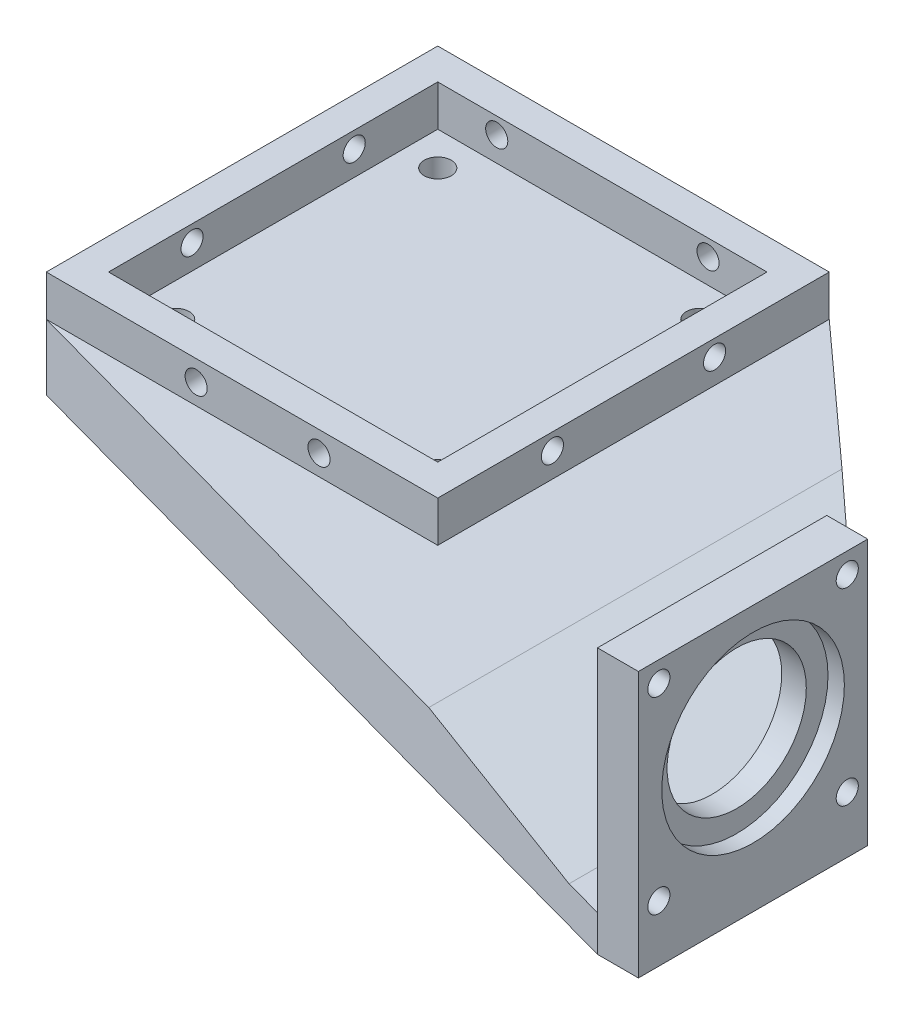
ISO-10303-21;
HEADER;
FILE_DESCRIPTION(('STEP AP214'),'2;1');
FILE_NAME('part.step','',(''),(''),'','','');
FILE_SCHEMA(('AUTOMOTIVE_DESIGN { 1 0 10303 214 1 1 1 1 }'));
ENDSEC;
DATA;
#1=APPLICATION_CONTEXT('core data for automotive mechanical design processes');
#2=APPLICATION_PROTOCOL_DEFINITION('international standard','automotive_design',2000,#1);
#3=PRODUCT_CONTEXT('',#1,'mechanical');
#4=PRODUCT('Part','Part','',(#3));
#5=PRODUCT_RELATED_PRODUCT_CATEGORY('part','',(#4));
#6=PRODUCT_DEFINITION_FORMATION('','',#4);
#7=PRODUCT_DEFINITION_CONTEXT('part definition',#1,'design');
#8=PRODUCT_DEFINITION('design','',#6,#7);
#9=PRODUCT_DEFINITION_SHAPE('','',#8);
#10=(LENGTH_UNIT() NAMED_UNIT(*) SI_UNIT(.MILLI.,.METRE.));
#11=(NAMED_UNIT(*) PLANE_ANGLE_UNIT() SI_UNIT($,.RADIAN.));
#12=(NAMED_UNIT(*) SI_UNIT($,.STERADIAN.) SOLID_ANGLE_UNIT());
#13=UNCERTAINTY_MEASURE_WITH_UNIT(LENGTH_MEASURE(1.E-05),#10,'distance_accuracy_value','');
#14=(GEOMETRIC_REPRESENTATION_CONTEXT(3) GLOBAL_UNCERTAINTY_ASSIGNED_CONTEXT((#13)) GLOBAL_UNIT_ASSIGNED_CONTEXT((#10,
#11,#12)) REPRESENTATION_CONTEXT('',''));
#15=CARTESIAN_POINT('',(0.,0.,0.));
#16=DIRECTION('',(0.,0.,1.));
#17=DIRECTION('',(1.,0.,0.));
#18=AXIS2_PLACEMENT_3D('',#15,#16,#17);
#19=CARTESIAN_POINT('',(0.,5.,0.));
#20=DIRECTION('',(0.,-1.,0.));
#21=DIRECTION('',(0.,0.,-1.));
#22=AXIS2_PLACEMENT_3D('',#19,#20,#21);
#23=PLANE('',#22);
#24=DIRECTION('',(-1.,0.,0.));
#25=VECTOR('',#24,1.);
#26=CARTESIAN_POINT('',(-23.9,5.,-23.9));
#27=LINE('',#26,#25);
#28=CARTESIAN_POINT('',(23.9,5.,-23.9));
#29=VERTEX_POINT('',#28);
#30=CARTESIAN_POINT('',(-23.9,5.,-23.9));
#31=VERTEX_POINT('',#30);
#32=EDGE_CURVE('E425',#29,#31,#27,.T.);
#33=ORIENTED_EDGE('',*,*,#32,.T.);
#34=DIRECTION('',(0.,0.,1.));
#35=VECTOR('',#34,1.);
#36=CARTESIAN_POINT('',(-23.9,5.,-23.9));
#37=LINE('',#36,#35);
#38=CARTESIAN_POINT('',(-23.9,5.,23.9));
#39=VERTEX_POINT('',#38);
#40=EDGE_CURVE('E429',#31,#39,#37,.T.);
#41=ORIENTED_EDGE('',*,*,#40,.T.);
#42=DIRECTION('',(1.,0.,0.));
#43=VECTOR('',#42,1.);
#44=CARTESIAN_POINT('',(-23.9,5.,23.9));
#45=LINE('',#44,#43);
#46=CARTESIAN_POINT('',(23.9,5.,23.9));
#47=VERTEX_POINT('',#46);
#48=EDGE_CURVE('E433',#39,#47,#45,.T.);
#49=ORIENTED_EDGE('',*,*,#48,.T.);
#50=DIRECTION('',(0.,0.,-1.));
#51=VECTOR('',#50,1.);
#52=CARTESIAN_POINT('',(23.9,5.,-23.9));
#53=LINE('',#52,#51);
#54=EDGE_CURVE('E436',#47,#29,#53,.T.);
#55=ORIENTED_EDGE('',*,*,#54,.T.);
#56=EDGE_LOOP('',(#33,#41,#49,#55));
#57=FACE_BOUND('',#56,.T.);
#58=DIRECTION('',(0.,0.,1.));
#59=VECTOR('',#58,1.);
#60=CARTESIAN_POINT('',(-20.1,5.,-20.1));
#61=LINE('',#60,#59);
#62=CARTESIAN_POINT('',(-20.1,5.,-20.1));
#63=VERTEX_POINT('',#62);
#64=CARTESIAN_POINT('',(-20.1,5.,20.1));
#65=VERTEX_POINT('',#64);
#66=EDGE_CURVE('E384',#63,#65,#61,.T.);
#67=ORIENTED_EDGE('',*,*,#66,.F.);
#68=DIRECTION('',(-1.,0.,0.));
#69=VECTOR('',#68,1.);
#70=CARTESIAN_POINT('',(-20.1,5.,-20.1));
#71=LINE('',#70,#69);
#72=CARTESIAN_POINT('',(20.1,5.,-20.1));
#73=VERTEX_POINT('',#72);
#74=EDGE_CURVE('E394',#73,#63,#71,.T.);
#75=ORIENTED_EDGE('',*,*,#74,.F.);
#76=DIRECTION('',(0.,0.,-1.));
#77=VECTOR('',#76,1.);
#78=CARTESIAN_POINT('',(20.1,5.,-20.1));
#79=LINE('',#78,#77);
#80=CARTESIAN_POINT('',(20.1,5.,20.1));
#81=VERTEX_POINT('',#80);
#82=EDGE_CURVE('E391',#81,#73,#79,.T.);
#83=ORIENTED_EDGE('',*,*,#82,.F.);
#84=DIRECTION('',(1.,0.,0.));
#85=VECTOR('',#84,1.);
#86=CARTESIAN_POINT('',(-20.1,5.,20.1));
#87=LINE('',#86,#85);
#88=EDGE_CURVE('E387',#65,#81,#87,.T.);
#89=ORIENTED_EDGE('',*,*,#88,.F.);
#90=EDGE_LOOP('',(#67,#75,#83,#89));
#91=FACE_BOUND('',#90,.T.);
#92=ADVANCED_FACE('F41',(#57,#91),#23,.F.);
#93=CARTESIAN_POINT('',(-23.9,5.,-23.9));
#94=DIRECTION('',(0.,0.,1.));
#95=DIRECTION('',(1.,0.,0.));
#96=AXIS2_PLACEMENT_3D('',#93,#94,#95);
#97=PLANE('',#96);
#98=CARTESIAN_POINT('',(12.9,3.,-23.9));
#99=DIRECTION('',(0.,0.,-1.));
#100=DIRECTION('',(-1.,0.,0.));
#101=AXIS2_PLACEMENT_3D('',#98,#99,#100);
#102=CIRCLE('',#101,1.35);
#103=CARTESIAN_POINT('',(11.55,3.,-23.9));
#104=VERTEX_POINT('',#103);
#105=EDGE_CURVE('E368',#104,#104,#102,.T.);
#106=ORIENTED_EDGE('',*,*,#105,.F.);
#107=EDGE_LOOP('',(#106));
#108=FACE_BOUND('',#107,.T.);
#109=CARTESIAN_POINT('',(-12.9,3.,-23.9));
#110=DIRECTION('',(0.,0.,-1.));
#111=DIRECTION('',(-1.,0.,0.));
#112=AXIS2_PLACEMENT_3D('',#109,#110,#111);
#113=CIRCLE('',#112,1.35);
#114=CARTESIAN_POINT('',(-14.25,3.,-23.9));
#115=VERTEX_POINT('',#114);
#116=EDGE_CURVE('E377',#115,#115,#113,.T.);
#117=ORIENTED_EDGE('',*,*,#116,.F.);
#118=EDGE_LOOP('',(#117));
#119=FACE_BOUND('',#118,.T.);
#120=DIRECTION('',(0.,-1.,0.));
#121=VECTOR('',#120,1.);
#122=CARTESIAN_POINT('',(23.9,5.,-23.9));
#123=LINE('',#122,#121);
#124=CARTESIAN_POINT('',(23.9,0.,-23.9));
#125=VERTEX_POINT('',#124);
#126=EDGE_CURVE('E439',#29,#125,#123,.T.);
#127=ORIENTED_EDGE('',*,*,#126,.T.);
#128=DIRECTION('',(0.,1.,0.));
#129=VECTOR('',#128,1.);
#130=CARTESIAN_POINT('',(23.9,-8.,-23.9));
#131=LINE('',#130,#129);
#132=CARTESIAN_POINT('',(23.9,-8.,-23.9));
#133=VERTEX_POINT('',#132);
#134=EDGE_CURVE('E319',#133,#125,#131,.T.);
#135=ORIENTED_EDGE('',*,*,#134,.F.);
#136=DIRECTION('',(-1.,0.,0.));
#137=VECTOR('',#136,1.);
#138=CARTESIAN_POINT('',(0.,-8.,-23.9));
#139=LINE('',#138,#137);
#140=CARTESIAN_POINT('',(-23.9,-8.,-23.9));
#141=VERTEX_POINT('',#140);
#142=EDGE_CURVE('E257',#133,#141,#139,.T.);
#143=ORIENTED_EDGE('',*,*,#142,.T.);
#144=DIRECTION('',(0.,-1.,0.));
#145=VECTOR('',#144,1.);
#146=CARTESIAN_POINT('',(-23.9,5.,-23.9));
#147=LINE('',#146,#145);
#148=EDGE_CURVE('E457',#31,#141,#147,.T.);
#149=ORIENTED_EDGE('',*,*,#148,.F.);
#150=ORIENTED_EDGE('',*,*,#32,.F.);
#151=EDGE_LOOP('',(#127,#135,#143,#149,#150));
#152=FACE_BOUND('',#151,.T.);
#153=ADVANCED_FACE('F43',(#108,#119,#152),#97,.F.);
#154=CARTESIAN_POINT('',(-23.9,5.,-23.9));
#155=DIRECTION('',(1.,0.,0.));
#156=DIRECTION('',(0.,0.,-1.));
#157=AXIS2_PLACEMENT_3D('',#154,#155,#156);
#158=PLANE('',#157);
#159=CARTESIAN_POINT('',(-23.9,3.,9.90000000000001));
#160=DIRECTION('',(1.,0.,0.));
#161=DIRECTION('',(0.,0.,-1.));
#162=AXIS2_PLACEMENT_3D('',#159,#160,#161);
#163=CIRCLE('',#162,1.35);
#164=CARTESIAN_POINT('',(-23.9,3.,8.55000000000001));
#165=VERTEX_POINT('',#164);
#166=EDGE_CURVE('E326',#165,#165,#163,.T.);
#167=ORIENTED_EDGE('',*,*,#166,.T.);
#168=EDGE_LOOP('',(#167));
#169=FACE_BOUND('',#168,.T.);
#170=CARTESIAN_POINT('',(-23.9,3.,-9.9));
#171=DIRECTION('',(1.,0.,0.));
#172=DIRECTION('',(0.,0.,1.));
#173=AXIS2_PLACEMENT_3D('',#170,#171,#172);
#174=CIRCLE('',#173,1.35);
#175=CARTESIAN_POINT('',(-23.9,3.,-8.55));
#176=VERTEX_POINT('',#175);
#177=EDGE_CURVE('E335',#176,#176,#174,.T.);
#178=ORIENTED_EDGE('',*,*,#177,.T.);
#179=EDGE_LOOP('',(#178));
#180=FACE_BOUND('',#179,.T.);
#181=ORIENTED_EDGE('',*,*,#148,.T.);
#182=DIRECTION('',(0.,0.,1.));
#183=VECTOR('',#182,1.);
#184=CARTESIAN_POINT('',(-23.9,-8.,0.));
#185=LINE('',#184,#183);
#186=CARTESIAN_POINT('',(-23.9,-8.,23.9));
#187=VERTEX_POINT('',#186);
#188=EDGE_CURVE('E261',#141,#187,#185,.T.);
#189=ORIENTED_EDGE('',*,*,#188,.T.);
#190=DIRECTION('',(0.,1.,0.));
#191=VECTOR('',#190,1.);
#192=CARTESIAN_POINT('',(-23.9,-8.,23.9));
#193=LINE('',#192,#191);
#194=CARTESIAN_POINT('',(-23.9,0.,23.9));
#195=VERTEX_POINT('',#194);
#196=EDGE_CURVE('E315',#187,#195,#193,.T.);
#197=ORIENTED_EDGE('',*,*,#196,.T.);
#198=DIRECTION('',(0.,-1.,0.));
#199=VECTOR('',#198,1.);
#200=CARTESIAN_POINT('',(-23.9,5.,23.9));
#201=LINE('',#200,#199);
#202=EDGE_CURVE('E453',#39,#195,#201,.T.);
#203=ORIENTED_EDGE('',*,*,#202,.F.);
#204=ORIENTED_EDGE('',*,*,#40,.F.);
#205=EDGE_LOOP('',(#181,#189,#197,#203,#204));
#206=FACE_BOUND('',#205,.T.);
#207=ADVANCED_FACE('F494',(#169,#180,#206),#158,.F.);
#208=CARTESIAN_POINT('',(-23.9,5.,23.9));
#209=DIRECTION('',(0.,0.,-1.));
#210=DIRECTION('',(-1.,0.,0.));
#211=AXIS2_PLACEMENT_3D('',#208,#209,#210);
#212=PLANE('',#211);
#213=CARTESIAN_POINT('',(9.4,2.5,23.9));
#214=DIRECTION('',(0.,0.,1.));
#215=DIRECTION('',(1.,0.,0.));
#216=AXIS2_PLACEMENT_3D('',#213,#214,#215);
#217=CIRCLE('',#216,1.35);
#218=CARTESIAN_POINT('',(10.75,2.5,23.9));
#219=VERTEX_POINT('',#218);
#220=EDGE_CURVE('E356',#219,#219,#217,.T.);
#221=ORIENTED_EDGE('',*,*,#220,.F.);
#222=EDGE_LOOP('',(#221));
#223=FACE_BOUND('',#222,.T.);
#224=CARTESIAN_POINT('',(-5.6,2.5,23.9));
#225=DIRECTION('',(0.,0.,1.));
#226=DIRECTION('',(1.,0.,0.));
#227=AXIS2_PLACEMENT_3D('',#224,#225,#226);
#228=CIRCLE('',#227,1.35);
#229=CARTESIAN_POINT('',(-4.24999999999999,2.5,23.9));
#230=VERTEX_POINT('',#229);
#231=EDGE_CURVE('E357',#230,#230,#228,.T.);
#232=ORIENTED_EDGE('',*,*,#231,.F.);
#233=EDGE_LOOP('',(#232));
#234=FACE_BOUND('',#233,.T.);
#235=DIRECTION('',(1.,0.,0.));
#236=VECTOR('',#235,1.);
#237=CARTESIAN_POINT('',(-23.9,0.,23.9));
#238=LINE('',#237,#236);
#239=CARTESIAN_POINT('',(23.9,0.,23.9));
#240=VERTEX_POINT('',#239);
#241=EDGE_CURVE('E424',#195,#240,#238,.T.);
#242=ORIENTED_EDGE('',*,*,#241,.T.);
#243=DIRECTION('',(0.,-1.,0.));
#244=VECTOR('',#243,1.);
#245=CARTESIAN_POINT('',(23.9,5.,23.9));
#246=LINE('',#245,#244);
#247=EDGE_CURVE('E449',#47,#240,#246,.T.);
#248=ORIENTED_EDGE('',*,*,#247,.F.);
#249=ORIENTED_EDGE('',*,*,#48,.F.);
#250=ORIENTED_EDGE('',*,*,#202,.T.);
#251=EDGE_LOOP('',(#242,#248,#249,#250));
#252=FACE_BOUND('',#251,.T.);
#253=ADVANCED_FACE('F491',(#223,#234,#252),#212,.F.);
#254=CARTESIAN_POINT('',(23.9,5.,-23.9));
#255=DIRECTION('',(-1.,0.,0.));
#256=DIRECTION('',(0.,0.,1.));
#257=AXIS2_PLACEMENT_3D('',#254,#255,#256);
#258=PLANE('',#257);
#259=CARTESIAN_POINT('',(23.9,3.,9.9));
#260=DIRECTION('',(1.,0.,0.));
#261=DIRECTION('',(0.,0.,-1.));
#262=AXIS2_PLACEMENT_3D('',#259,#260,#261);
#263=CIRCLE('',#262,1.35);
#264=CARTESIAN_POINT('',(23.9,3.,8.55));
#265=VERTEX_POINT('',#264);
#266=EDGE_CURVE('E331',#265,#265,#263,.T.);
#267=ORIENTED_EDGE('',*,*,#266,.F.);
#268=EDGE_LOOP('',(#267));
#269=FACE_BOUND('',#268,.T.);
#270=CARTESIAN_POINT('',(23.9,3.,-9.90000000000001));
#271=DIRECTION('',(1.,0.,0.));
#272=DIRECTION('',(0.,0.,1.));
#273=AXIS2_PLACEMENT_3D('',#270,#271,#272);
#274=CIRCLE('',#273,1.35);
#275=CARTESIAN_POINT('',(23.9,3.,-8.55000000000001));
#276=VERTEX_POINT('',#275);
#277=EDGE_CURVE('E311',#276,#276,#274,.T.);
#278=ORIENTED_EDGE('',*,*,#277,.F.);
#279=EDGE_LOOP('',(#278));
#280=FACE_BOUND('',#279,.T.);
#281=DIRECTION('',(0.,0.,-1.));
#282=VECTOR('',#281,1.);
#283=CARTESIAN_POINT('',(23.9,0.,-23.9));
#284=LINE('',#283,#282);
#285=EDGE_CURVE('E430',#240,#125,#284,.T.);
#286=ORIENTED_EDGE('',*,*,#285,.T.);
#287=ORIENTED_EDGE('',*,*,#126,.F.);
#288=ORIENTED_EDGE('',*,*,#54,.F.);
#289=ORIENTED_EDGE('',*,*,#247,.T.);
#290=EDGE_LOOP('',(#286,#287,#288,#289));
#291=FACE_BOUND('',#290,.T.);
#292=ADVANCED_FACE('F481',(#269,#280,#291),#258,.F.);
#293=CARTESIAN_POINT('',(-20.1,5.,-20.1));
#294=DIRECTION('',(1.,0.,0.));
#295=DIRECTION('',(0.,0.,-1.));
#296=AXIS2_PLACEMENT_3D('',#293,#294,#295);
#297=PLANE('',#296);
#298=CARTESIAN_POINT('',(-20.1,3.,9.90000000000001));
#299=DIRECTION('',(1.,0.,0.));
#300=DIRECTION('',(0.,0.,-1.));
#301=AXIS2_PLACEMENT_3D('',#298,#299,#300);
#302=CIRCLE('',#301,1.35);
#303=CARTESIAN_POINT('',(-20.1,3.,8.55000000000001));
#304=VERTEX_POINT('',#303);
#305=EDGE_CURVE('E347',#304,#304,#302,.T.);
#306=ORIENTED_EDGE('',*,*,#305,.F.);
#307=EDGE_LOOP('',(#306));
#308=FACE_BOUND('',#307,.T.);
#309=CARTESIAN_POINT('',(-20.1,3.,-9.9));
#310=DIRECTION('',(1.,0.,0.));
#311=DIRECTION('',(0.,0.,-1.));
#312=AXIS2_PLACEMENT_3D('',#309,#310,#311);
#313=CIRCLE('',#312,1.35);
#314=CARTESIAN_POINT('',(-20.1,3.,-11.25));
#315=VERTEX_POINT('',#314);
#316=EDGE_CURVE('E342',#315,#315,#313,.T.);
#317=ORIENTED_EDGE('',*,*,#316,.F.);
#318=EDGE_LOOP('',(#317));
#319=FACE_BOUND('',#318,.T.);
#320=DIRECTION('',(0.,0.,1.));
#321=VECTOR('',#320,1.);
#322=CARTESIAN_POINT('',(-20.1,0.,-20.1));
#323=LINE('',#322,#321);
#324=CARTESIAN_POINT('',(-20.1,0.,-20.1));
#325=VERTEX_POINT('',#324);
#326=CARTESIAN_POINT('',(-20.1,0.,20.1));
#327=VERTEX_POINT('',#326);
#328=EDGE_CURVE('E372',#325,#327,#323,.T.);
#329=ORIENTED_EDGE('',*,*,#328,.F.);
#330=DIRECTION('',(0.,-1.,0.));
#331=VECTOR('',#330,1.);
#332=CARTESIAN_POINT('',(-20.1,5.,-20.1));
#333=LINE('',#332,#331);
#334=EDGE_CURVE('E397',#63,#325,#333,.T.);
#335=ORIENTED_EDGE('',*,*,#334,.F.);
#336=ORIENTED_EDGE('',*,*,#66,.T.);
#337=DIRECTION('',(0.,-1.,0.));
#338=VECTOR('',#337,1.);
#339=CARTESIAN_POINT('',(-20.1,5.,20.1));
#340=LINE('',#339,#338);
#341=EDGE_CURVE('E420',#65,#327,#340,.T.);
#342=ORIENTED_EDGE('',*,*,#341,.T.);
#343=EDGE_LOOP('',(#329,#335,#336,#342));
#344=FACE_BOUND('',#343,.T.);
#345=ADVANCED_FACE('F533',(#308,#319,#344),#297,.T.);
#346=CARTESIAN_POINT('',(-20.1,5.,20.1));
#347=DIRECTION('',(0.,0.,-1.));
#348=DIRECTION('',(-1.,0.,0.));
#349=AXIS2_PLACEMENT_3D('',#346,#347,#348);
#350=PLANE('',#349);
#351=CARTESIAN_POINT('',(9.4,2.5,20.1));
#352=DIRECTION('',(0.,0.,-1.));
#353=DIRECTION('',(-1.,0.,0.));
#354=AXIS2_PLACEMENT_3D('',#351,#352,#353);
#355=CIRCLE('',#354,1.35);
#356=CARTESIAN_POINT('',(8.05,2.5,20.1));
#357=VERTEX_POINT('',#356);
#358=EDGE_CURVE('E352',#357,#357,#355,.F.);
#359=ORIENTED_EDGE('',*,*,#358,.T.);
#360=EDGE_LOOP('',(#359));
#361=FACE_BOUND('',#360,.T.);
#362=CARTESIAN_POINT('',(-5.6,2.5,20.1));
#363=DIRECTION('',(0.,0.,-1.));
#364=DIRECTION('',(-1.,0.,0.));
#365=AXIS2_PLACEMENT_3D('',#362,#363,#364);
#366=CIRCLE('',#365,1.35);
#367=CARTESIAN_POINT('',(-6.95,2.5,20.1));
#368=VERTEX_POINT('',#367);
#369=EDGE_CURVE('E351',#368,#368,#366,.F.);
#370=ORIENTED_EDGE('',*,*,#369,.T.);
#371=EDGE_LOOP('',(#370));
#372=FACE_BOUND('',#371,.T.);
#373=DIRECTION('',(1.,0.,0.));
#374=VECTOR('',#373,1.);
#375=CARTESIAN_POINT('',(-20.1,0.,20.1));
#376=LINE('',#375,#374);
#377=CARTESIAN_POINT('',(20.1,0.,20.1));
#378=VERTEX_POINT('',#377);
#379=EDGE_CURVE('E401',#327,#378,#376,.T.);
#380=ORIENTED_EDGE('',*,*,#379,.F.);
#381=ORIENTED_EDGE('',*,*,#341,.F.);
#382=ORIENTED_EDGE('',*,*,#88,.T.);
#383=DIRECTION('',(0.,-1.,0.));
#384=VECTOR('',#383,1.);
#385=CARTESIAN_POINT('',(20.1,5.,20.1));
#386=LINE('',#385,#384);
#387=EDGE_CURVE('E417',#81,#378,#386,.T.);
#388=ORIENTED_EDGE('',*,*,#387,.T.);
#389=EDGE_LOOP('',(#380,#381,#382,#388));
#390=FACE_BOUND('',#389,.T.);
#391=ADVANCED_FACE('F580',(#361,#372,#390),#350,.T.);
#392=CARTESIAN_POINT('',(20.1,5.,-20.1));
#393=DIRECTION('',(-1.,0.,0.));
#394=DIRECTION('',(0.,0.,1.));
#395=AXIS2_PLACEMENT_3D('',#392,#393,#394);
#396=PLANE('',#395);
#397=CARTESIAN_POINT('',(20.1,3.,9.9));
#398=DIRECTION('',(-1.,0.,0.));
#399=DIRECTION('',(0.,0.,1.));
#400=AXIS2_PLACEMENT_3D('',#397,#398,#399);
#401=CIRCLE('',#400,1.35);
#402=CARTESIAN_POINT('',(20.1,3.,11.25));
#403=VERTEX_POINT('',#402);
#404=EDGE_CURVE('E346',#403,#403,#401,.T.);
#405=ORIENTED_EDGE('',*,*,#404,.F.);
#406=EDGE_LOOP('',(#405));
#407=FACE_BOUND('',#406,.T.);
#408=CARTESIAN_POINT('',(20.1,3.,-9.90000000000001));
#409=DIRECTION('',(-1.,0.,0.));
#410=DIRECTION('',(0.,0.,1.));
#411=AXIS2_PLACEMENT_3D('',#408,#409,#410);
#412=CIRCLE('',#411,1.35);
#413=CARTESIAN_POINT('',(20.1,3.,-8.55000000000001));
#414=VERTEX_POINT('',#413);
#415=EDGE_CURVE('E330',#414,#414,#412,.T.);
#416=ORIENTED_EDGE('',*,*,#415,.F.);
#417=EDGE_LOOP('',(#416));
#418=FACE_BOUND('',#417,.T.);
#419=DIRECTION('',(0.,0.,-1.));
#420=VECTOR('',#419,1.);
#421=CARTESIAN_POINT('',(20.1,0.,-20.1));
#422=LINE('',#421,#420);
#423=CARTESIAN_POINT('',(20.1,0.,-20.1));
#424=VERTEX_POINT('',#423);
#425=EDGE_CURVE('E405',#378,#424,#422,.T.);
#426=ORIENTED_EDGE('',*,*,#425,.F.);
#427=ORIENTED_EDGE('',*,*,#387,.F.);
#428=ORIENTED_EDGE('',*,*,#82,.T.);
#429=DIRECTION('',(0.,-1.,0.));
#430=VECTOR('',#429,1.);
#431=CARTESIAN_POINT('',(20.1,5.,-20.1));
#432=LINE('',#431,#430);
#433=EDGE_CURVE('E64',#73,#424,#432,.T.);
#434=ORIENTED_EDGE('',*,*,#433,.T.);
#435=EDGE_LOOP('',(#426,#427,#428,#434));
#436=FACE_BOUND('',#435,.T.);
#437=ADVANCED_FACE('F576',(#407,#418,#436),#396,.T.);
#438=CARTESIAN_POINT('',(-20.1,5.,-20.1));
#439=DIRECTION('',(0.,0.,1.));
#440=DIRECTION('',(1.,0.,0.));
#441=AXIS2_PLACEMENT_3D('',#438,#439,#440);
#442=PLANE('',#441);
#443=CARTESIAN_POINT('',(12.9,3.,-20.1));
#444=DIRECTION('',(0.,0.,1.));
#445=DIRECTION('',(1.,0.,0.));
#446=AXIS2_PLACEMENT_3D('',#443,#444,#445);
#447=CIRCLE('',#446,1.35);
#448=CARTESIAN_POINT('',(14.25,3.,-20.1));
#449=VERTEX_POINT('',#448);
#450=EDGE_CURVE('E373',#449,#449,#447,.F.);
#451=ORIENTED_EDGE('',*,*,#450,.T.);
#452=EDGE_LOOP('',(#451));
#453=FACE_BOUND('',#452,.T.);
#454=CARTESIAN_POINT('',(-12.9,3.,-20.1));
#455=DIRECTION('',(0.,0.,1.));
#456=DIRECTION('',(1.,0.,0.));
#457=AXIS2_PLACEMENT_3D('',#454,#455,#456);
#458=CIRCLE('',#457,1.35);
#459=CARTESIAN_POINT('',(-11.55,3.,-20.1));
#460=VERTEX_POINT('',#459);
#461=EDGE_CURVE('E361',#460,#460,#458,.F.);
#462=ORIENTED_EDGE('',*,*,#461,.T.);
#463=EDGE_LOOP('',(#462));
#464=FACE_BOUND('',#463,.T.);
#465=DIRECTION('',(-1.,0.,0.));
#466=VECTOR('',#465,1.);
#467=CARTESIAN_POINT('',(-20.1,0.,-20.1));
#468=LINE('',#467,#466);
#469=EDGE_CURVE('E388',#424,#325,#468,.T.);
#470=ORIENTED_EDGE('',*,*,#469,.F.);
#471=ORIENTED_EDGE('',*,*,#433,.F.);
#472=ORIENTED_EDGE('',*,*,#74,.T.);
#473=ORIENTED_EDGE('',*,*,#334,.T.);
#474=EDGE_LOOP('',(#470,#471,#472,#473));
#475=FACE_BOUND('',#474,.T.);
#476=ADVANCED_FACE('F579',(#453,#464,#475),#442,.T.);
#477=CARTESIAN_POINT('',(-12.9,3.,23.901));
#478=DIRECTION('',(0.,0.,-1.));
#479=DIRECTION('',(-1.,0.,0.));
#480=AXIS2_PLACEMENT_3D('',#477,#478,#479);
#481=CYLINDRICAL_SURFACE('',#480,1.35);
#482=ORIENTED_EDGE('',*,*,#461,.F.);
#483=EDGE_LOOP('',(#482));
#484=FACE_BOUND('',#483,.T.);
#485=ORIENTED_EDGE('',*,*,#116,.T.);
#486=EDGE_LOOP('',(#485));
#487=FACE_BOUND('',#486,.T.);
#488=ADVANCED_FACE('F597',(#484,#487),#481,.F.);
#489=CARTESIAN_POINT('',(12.9,3.,23.901));
#490=DIRECTION('',(0.,0.,-1.));
#491=DIRECTION('',(-1.,0.,0.));
#492=AXIS2_PLACEMENT_3D('',#489,#490,#491);
#493=CYLINDRICAL_SURFACE('',#492,1.35);
#494=ORIENTED_EDGE('',*,*,#450,.F.);
#495=EDGE_LOOP('',(#494));
#496=FACE_BOUND('',#495,.T.);
#497=ORIENTED_EDGE('',*,*,#105,.T.);
#498=EDGE_LOOP('',(#497));
#499=FACE_BOUND('',#498,.T.);
#500=ADVANCED_FACE('F603',(#496,#499),#493,.F.);
#501=CARTESIAN_POINT('',(-5.6,2.5,-23.901));
#502=DIRECTION('',(0.,0.,1.));
#503=DIRECTION('',(1.,0.,0.));
#504=AXIS2_PLACEMENT_3D('',#501,#502,#503);
#505=CYLINDRICAL_SURFACE('',#504,1.35);
#506=ORIENTED_EDGE('',*,*,#369,.F.);
#507=EDGE_LOOP('',(#506));
#508=FACE_BOUND('',#507,.T.);
#509=ORIENTED_EDGE('',*,*,#231,.T.);
#510=EDGE_LOOP('',(#509));
#511=FACE_BOUND('',#510,.T.);
#512=ADVANCED_FACE('F569',(#508,#511),#505,.F.);
#513=CARTESIAN_POINT('',(9.4,2.5,-23.901));
#514=DIRECTION('',(0.,0.,1.));
#515=DIRECTION('',(1.,0.,0.));
#516=AXIS2_PLACEMENT_3D('',#513,#514,#515);
#517=CYLINDRICAL_SURFACE('',#516,1.35);
#518=ORIENTED_EDGE('',*,*,#358,.F.);
#519=EDGE_LOOP('',(#518));
#520=FACE_BOUND('',#519,.T.);
#521=ORIENTED_EDGE('',*,*,#220,.T.);
#522=EDGE_LOOP('',(#521));
#523=FACE_BOUND('',#522,.T.);
#524=ADVANCED_FACE('F564',(#520,#523),#517,.F.);
#525=CARTESIAN_POINT('',(-23.9,3.,-9.9));
#526=DIRECTION('',(1.,0.,0.));
#527=DIRECTION('',(0.,0.,-1.));
#528=AXIS2_PLACEMENT_3D('',#525,#526,#527);
#529=CYLINDRICAL_SURFACE('',#528,1.35);
#530=ORIENTED_EDGE('',*,*,#415,.T.);
#531=EDGE_LOOP('',(#530));
#532=FACE_BOUND('',#531,.T.);
#533=ORIENTED_EDGE('',*,*,#277,.T.);
#534=EDGE_LOOP('',(#533));
#535=FACE_BOUND('',#534,.T.);
#536=ADVANCED_FACE('F554',(#532,#535),#529,.F.);
#537=CARTESIAN_POINT('',(-23.9,3.,9.90000000000001));
#538=DIRECTION('',(1.,0.,0.));
#539=DIRECTION('',(0.,0.,-1.));
#540=AXIS2_PLACEMENT_3D('',#537,#538,#539);
#541=CYLINDRICAL_SURFACE('',#540,1.35);
#542=ORIENTED_EDGE('',*,*,#404,.T.);
#543=EDGE_LOOP('',(#542));
#544=FACE_BOUND('',#543,.T.);
#545=ORIENTED_EDGE('',*,*,#266,.T.);
#546=EDGE_LOOP('',(#545));
#547=FACE_BOUND('',#546,.T.);
#548=ADVANCED_FACE('F551',(#544,#547),#541,.F.);
#549=ORIENTED_EDGE('',*,*,#316,.T.);
#550=EDGE_LOOP('',(#549));
#551=FACE_BOUND('',#550,.T.);
#552=ORIENTED_EDGE('',*,*,#177,.F.);
#553=EDGE_LOOP('',(#552));
#554=FACE_BOUND('',#553,.T.);
#555=ADVANCED_FACE('F548',(#551,#554),#529,.F.);
#556=ORIENTED_EDGE('',*,*,#305,.T.);
#557=EDGE_LOOP('',(#556));
#558=FACE_BOUND('',#557,.T.);
#559=ORIENTED_EDGE('',*,*,#166,.F.);
#560=EDGE_LOOP('',(#559));
#561=FACE_BOUND('',#560,.T.);
#562=ADVANCED_FACE('F550',(#558,#561),#541,.F.);
#563=CARTESIAN_POINT('',(0.,0.,0.));
#564=DIRECTION('',(0.,1.,0.));
#565=DIRECTION('',(0.,0.,1.));
#566=AXIS2_PLACEMENT_3D('',#563,#564,#565);
#567=PLANE('',#566);
#568=DIRECTION('',(0.,0.,1.));
#569=VECTOR('',#568,1.);
#570=CARTESIAN_POINT('',(40.5030066481104,0.,0.));
#571=LINE('',#570,#569);
#572=CARTESIAN_POINT('',(40.5030066481104,0.,-8.85767597681194));
#573=VERTEX_POINT('',#572);
#574=CARTESIAN_POINT('',(40.5030066481104,0.,41.596946869901));
#575=VERTEX_POINT('',#574);
#576=EDGE_CURVE('E238',#573,#575,#571,.T.);
#577=ORIENTED_EDGE('',*,*,#576,.F.);
#578=DIRECTION('',(-0.741079132313375,0.,-0.671417693875918));
#579=VECTOR('',#578,1.);
#580=CARTESIAN_POINT('',(22.6661711433649,0.,-25.0178489441114));
#581=LINE('',#580,#579);
#582=EDGE_CURVE('E247',#573,#125,#581,.T.);
#583=ORIENTED_EDGE('',*,*,#582,.T.);
#584=ORIENTED_EDGE('',*,*,#285,.F.);
#585=ORIENTED_EDGE('',*,*,#241,.F.);
#586=DIRECTION('',(-0.964258504363171,0.,-0.264963274367035));
#587=VECTOR('',#586,1.);
#588=CARTESIAN_POINT('',(-7.78419719523348,0.,28.3283725379477));
#589=LINE('',#588,#587);
#590=EDGE_CURVE('E290',#575,#195,#589,.T.);
#591=ORIENTED_EDGE('',*,*,#590,.F.);
#592=EDGE_LOOP('',(#577,#583,#584,#585,#591));
#593=FACE_BOUND('',#592,.T.);
#594=ADVANCED_FACE('F473',(#593),#567,.T.);
#595=CARTESIAN_POINT('',(73.9,-8.,0.));
#596=DIRECTION('',(-1.,0.,0.));
#597=DIRECTION('',(0.,0.,1.));
#598=AXIS2_PLACEMENT_3D('',#595,#596,#597);
#599=PLANE('',#598);
#600=DIRECTION('',(0.,1.,0.));
#601=VECTOR('',#600,1.);
#602=CARTESIAN_POINT('',(73.9,-8.,21.4));
#603=LINE('',#602,#601);
#604=CARTESIAN_POINT('',(73.9,-8.,21.4));
#605=VERTEX_POINT('',#604);
#606=CARTESIAN_POINT('',(73.9,-3.58718347907107,21.4));
#607=VERTEX_POINT('',#606);
#608=EDGE_CURVE('E287',#605,#607,#603,.T.);
#609=ORIENTED_EDGE('',*,*,#608,.T.);
#610=DIRECTION('',(0.,1.,0.));
#611=VECTOR('',#610,1.);
#612=CARTESIAN_POINT('',(73.9,0.,21.4));
#613=LINE('',#612,#611);
#614=CARTESIAN_POINT('',(73.9,24.4128165209289,21.4));
#615=VERTEX_POINT('',#614);
#616=EDGE_CURVE('E159',#607,#615,#613,.T.);
#617=ORIENTED_EDGE('',*,*,#616,.T.);
#618=DIRECTION('',(0.,0.,1.));
#619=VECTOR('',#618,1.);
#620=CARTESIAN_POINT('',(73.9,24.4128165209289,0.));
#621=LINE('',#620,#619);
#622=CARTESIAN_POINT('',(73.9,24.4128165209289,49.4));
#623=VERTEX_POINT('',#622);
#624=EDGE_CURVE('E218',#615,#623,#621,.T.);
#625=ORIENTED_EDGE('',*,*,#624,.T.);
#626=DIRECTION('',(0.,1.,0.));
#627=VECTOR('',#626,1.);
#628=CARTESIAN_POINT('',(73.9,-8.,49.4));
#629=LINE('',#628,#627);
#630=CARTESIAN_POINT('',(73.9,-8.,49.4));
#631=VERTEX_POINT('',#630);
#632=EDGE_CURVE('E308',#631,#623,#629,.T.);
#633=ORIENTED_EDGE('',*,*,#632,.F.);
#634=DIRECTION('',(0.,0.,1.));
#635=VECTOR('',#634,1.);
#636=CARTESIAN_POINT('',(73.9,-8.,0.));
#637=LINE('',#636,#635);
#638=EDGE_CURVE('E248',#605,#631,#637,.T.);
#639=ORIENTED_EDGE('',*,*,#638,.F.);
#640=EDGE_LOOP('',(#609,#617,#625,#633,#639));
#641=FACE_BOUND('',#640,.T.);
#642=CARTESIAN_POINT('',(73.9,-1.08718347907109,46.9));
#643=DIRECTION('',(1.,0.,0.));
#644=DIRECTION('',(0.,0.,-1.));
#645=AXIS2_PLACEMENT_3D('',#642,#643,#644);
#646=CIRCLE('',#645,1.35);
#647=CARTESIAN_POINT('',(73.9,-1.08718347907109,45.55));
#648=VERTEX_POINT('',#647);
#649=EDGE_CURVE('E203',#648,#648,#646,.T.);
#650=ORIENTED_EDGE('',*,*,#649,.F.);
#651=EDGE_LOOP('',(#650));
#652=FACE_BOUND('',#651,.T.);
#653=CARTESIAN_POINT('',(73.9,10.4128165209289,35.4));
#654=DIRECTION('',(1.,0.,0.));
#655=DIRECTION('',(0.,0.,-1.));
#656=AXIS2_PLACEMENT_3D('',#653,#654,#655);
#657=CIRCLE('',#656,11.15);
#658=CARTESIAN_POINT('',(73.9,10.4128165209289,24.25));
#659=VERTEX_POINT('',#658);
#660=EDGE_CURVE('E207',#659,#659,#657,.T.);
#661=ORIENTED_EDGE('',*,*,#660,.F.);
#662=EDGE_LOOP('',(#661));
#663=FACE_BOUND('',#662,.T.);
#664=CARTESIAN_POINT('',(73.9,-1.08718347907109,23.9));
#665=DIRECTION('',(1.,0.,0.));
#666=DIRECTION('',(0.,0.,-1.));
#667=AXIS2_PLACEMENT_3D('',#664,#665,#666);
#668=CIRCLE('',#667,1.35);
#669=CARTESIAN_POINT('',(73.9,-1.08718347907109,22.55));
#670=VERTEX_POINT('',#669);
#671=EDGE_CURVE('E212',#670,#670,#668,.T.);
#672=ORIENTED_EDGE('',*,*,#671,.F.);
#673=EDGE_LOOP('',(#672));
#674=FACE_BOUND('',#673,.T.);
#675=CARTESIAN_POINT('',(73.9,21.9128165209289,23.9));
#676=DIRECTION('',(1.,0.,0.));
#677=DIRECTION('',(0.,0.,-1.));
#678=AXIS2_PLACEMENT_3D('',#675,#676,#677);
#679=CIRCLE('',#678,1.35);
#680=CARTESIAN_POINT('',(73.9,21.9128165209289,22.55));
#681=VERTEX_POINT('',#680);
#682=EDGE_CURVE('E222',#681,#681,#679,.T.);
#683=ORIENTED_EDGE('',*,*,#682,.F.);
#684=EDGE_LOOP('',(#683));
#685=FACE_BOUND('',#684,.T.);
#686=CARTESIAN_POINT('',(73.9,21.9128165209289,46.9));
#687=DIRECTION('',(1.,0.,0.));
#688=DIRECTION('',(0.,0.,-1.));
#689=AXIS2_PLACEMENT_3D('',#686,#687,#688);
#690=CIRCLE('',#689,1.35);
#691=CARTESIAN_POINT('',(73.9,21.9128165209289,45.55));
#692=VERTEX_POINT('',#691);
#693=EDGE_CURVE('E226',#692,#692,#690,.T.);
#694=ORIENTED_EDGE('',*,*,#693,.F.);
#695=EDGE_LOOP('',(#694));
#696=FACE_BOUND('',#695,.T.);
#697=ADVANCED_FACE('F501',(#641,#652,#663,#674,#685,#696),#599,.F.);
#698=CARTESIAN_POINT('',(0.,-8.,49.4));
#699=DIRECTION('',(0.,0.,-1.));
#700=DIRECTION('',(-1.,0.,0.));
#701=AXIS2_PLACEMENT_3D('',#698,#699,#700);
#702=PLANE('',#701);
#703=ORIENTED_EDGE('',*,*,#632,.T.);
#704=DIRECTION('',(1.,0.,0.));
#705=VECTOR('',#704,1.);
#706=CARTESIAN_POINT('',(68.9,24.4128165209289,49.4));
#707=LINE('',#706,#705);
#708=CARTESIAN_POINT('',(68.9,24.4128165209289,49.4));
#709=VERTEX_POINT('',#708);
#710=EDGE_CURVE('E230',#709,#623,#707,.T.);
#711=ORIENTED_EDGE('',*,*,#710,.F.);
#712=DIRECTION('',(0.,1.,0.));
#713=VECTOR('',#712,1.);
#714=CARTESIAN_POINT('',(68.9,0.,49.4));
#715=LINE('',#714,#713);
#716=CARTESIAN_POINT('',(68.9,-3.58718347907107,49.4));
#717=VERTEX_POINT('',#716);
#718=EDGE_CURVE('E193',#717,#709,#715,.T.);
#719=ORIENTED_EDGE('',*,*,#718,.F.);
#720=DIRECTION('',(0.,1.,0.));
#721=VECTOR('',#720,1.);
#722=CARTESIAN_POINT('',(68.9,-8.,49.4));
#723=LINE('',#722,#721);
#724=CARTESIAN_POINT('',(68.9,-8.,49.4));
#725=VERTEX_POINT('',#724);
#726=EDGE_CURVE('E312',#725,#717,#723,.T.);
#727=ORIENTED_EDGE('',*,*,#726,.F.);
#728=DIRECTION('',(-1.,0.,0.));
#729=VECTOR('',#728,1.);
#730=CARTESIAN_POINT('',(0.,-8.,49.4));
#731=LINE('',#730,#729);
#732=EDGE_CURVE('E268',#631,#725,#731,.T.);
#733=ORIENTED_EDGE('',*,*,#732,.F.);
#734=EDGE_LOOP('',(#703,#711,#719,#727,#733));
#735=FACE_BOUND('',#734,.T.);
#736=ADVANCED_FACE('F509',(#735),#702,.F.);
#737=CARTESIAN_POINT('',(-7.78419719523348,-8.,28.3283725379477));
#738=DIRECTION('',(0.264963274367035,0.,-0.964258504363171));
#739=DIRECTION('',(-0.964258504363171,0.,-0.264963274367035));
#740=AXIS2_PLACEMENT_3D('',#737,#738,#739);
#741=PLANE('',#740);
#742=ORIENTED_EDGE('',*,*,#726,.T.);
#743=DIRECTION('',(-0.964258504363171,0.,-0.264963274367035));
#744=VECTOR('',#743,1.);
#745=CARTESIAN_POINT('',(-7.78419719523348,-3.58718347907109,28.3283725379477));
#746=LINE('',#745,#744);
#747=CARTESIAN_POINT('',(64.1143802318094,-3.58718347907108,48.0849859473183));
#748=VERTEX_POINT('',#747);
#749=EDGE_CURVE('E180',#717,#748,#746,.T.);
#750=ORIENTED_EDGE('',*,*,#749,.T.);
#751=DIRECTION('',(-0.95407510851392,0.144948893164644,-0.262165035205873));
#752=VECTOR('',#751,1.);
#753=CARTESIAN_POINT('',(-5.66333722429639,7.01387174452845,28.9111519480651));
#754=LINE('',#753,#752);
#755=EDGE_CURVE('E241',#748,#575,#754,.T.);
#756=ORIENTED_EDGE('',*,*,#755,.T.);
#757=ORIENTED_EDGE('',*,*,#590,.T.);
#758=ORIENTED_EDGE('',*,*,#196,.F.);
#759=DIRECTION('',(-0.964258504363171,0.,-0.264963274367035));
#760=VECTOR('',#759,1.);
#761=CARTESIAN_POINT('',(-7.78419719523348,-8.,28.3283725379477));
#762=LINE('',#761,#760);
#763=EDGE_CURVE('E265',#725,#187,#762,.T.);
#764=ORIENTED_EDGE('',*,*,#763,.F.);
#765=EDGE_LOOP('',(#742,#750,#756,#757,#758,#764));
#766=FACE_BOUND('',#765,.T.);
#767=ADVANCED_FACE('F498',(#766),#741,.F.);
#768=CARTESIAN_POINT('',(16.,-8.,-16.));
#769=DIRECTION('',(0.,1.,0.));
#770=DIRECTION('',(0.,0.,1.));
#771=AXIS2_PLACEMENT_3D('',#768,#769,#770);
#772=CYLINDRICAL_SURFACE('',#771,1.65);
#773=CARTESIAN_POINT('',(16.,-8.,-16.));
#774=DIRECTION('',(0.,1.,0.));
#775=DIRECTION('',(0.,0.,1.));
#776=AXIS2_PLACEMENT_3D('',#773,#774,#775);
#777=CIRCLE('',#776,1.65);
#778=CARTESIAN_POINT('',(16.,-8.,-14.35));
#779=VERTEX_POINT('',#778);
#780=EDGE_CURVE('E279',#779,#779,#777,.T.);
#781=ORIENTED_EDGE('',*,*,#780,.F.);
#782=EDGE_LOOP('',(#781));
#783=FACE_BOUND('',#782,.T.);
#784=CARTESIAN_POINT('',(16.,0.,-16.));
#785=DIRECTION('',(0.,1.,0.));
#786=DIRECTION('',(0.,0.,1.));
#787=AXIS2_PLACEMENT_3D('',#784,#785,#786);
#788=CIRCLE('',#787,1.65);
#789=CARTESIAN_POINT('',(16.,0.,-14.35));
#790=VERTEX_POINT('',#789);
#791=EDGE_CURVE('E301',#790,#790,#788,.T.);
#792=ORIENTED_EDGE('',*,*,#791,.T.);
#793=EDGE_LOOP('',(#792));
#794=FACE_BOUND('',#793,.T.);
#795=ADVANCED_FACE('F691',(#783,#794),#772,.F.);
#796=CARTESIAN_POINT('',(16.,-8.,16.));
#797=DIRECTION('',(0.,1.,0.));
#798=DIRECTION('',(0.,0.,1.));
#799=AXIS2_PLACEMENT_3D('',#796,#797,#798);
#800=CYLINDRICAL_SURFACE('',#799,1.65);
#801=CARTESIAN_POINT('',(16.,-8.,16.));
#802=DIRECTION('',(0.,1.,0.));
#803=DIRECTION('',(0.,0.,1.));
#804=AXIS2_PLACEMENT_3D('',#801,#802,#803);
#805=CIRCLE('',#804,1.65);
#806=CARTESIAN_POINT('',(16.,-8.,17.65));
#807=VERTEX_POINT('',#806);
#808=EDGE_CURVE('E275',#807,#807,#805,.T.);
#809=ORIENTED_EDGE('',*,*,#808,.F.);
#810=EDGE_LOOP('',(#809));
#811=FACE_BOUND('',#810,.T.);
#812=CARTESIAN_POINT('',(16.,0.,16.));
#813=DIRECTION('',(0.,1.,0.));
#814=DIRECTION('',(0.,0.,1.));
#815=AXIS2_PLACEMENT_3D('',#812,#813,#814);
#816=CIRCLE('',#815,1.65);
#817=CARTESIAN_POINT('',(16.,0.,17.65));
#818=VERTEX_POINT('',#817);
#819=EDGE_CURVE('E297',#818,#818,#816,.T.);
#820=ORIENTED_EDGE('',*,*,#819,.T.);
#821=EDGE_LOOP('',(#820));
#822=FACE_BOUND('',#821,.T.);
#823=ADVANCED_FACE('F696',(#811,#822),#800,.F.);
#824=CARTESIAN_POINT('',(-16.,-8.,16.));
#825=DIRECTION('',(0.,1.,0.));
#826=DIRECTION('',(0.,0.,1.));
#827=AXIS2_PLACEMENT_3D('',#824,#825,#826);
#828=CYLINDRICAL_SURFACE('',#827,1.65);
#829=CARTESIAN_POINT('',(-16.,-8.,16.));
#830=DIRECTION('',(0.,1.,0.));
#831=DIRECTION('',(0.,0.,1.));
#832=AXIS2_PLACEMENT_3D('',#829,#830,#831);
#833=CIRCLE('',#832,1.65);
#834=CARTESIAN_POINT('',(-16.,-8.,17.65));
#835=VERTEX_POINT('',#834);
#836=EDGE_CURVE('E271',#835,#835,#833,.T.);
#837=ORIENTED_EDGE('',*,*,#836,.F.);
#838=EDGE_LOOP('',(#837));
#839=FACE_BOUND('',#838,.T.);
#840=CARTESIAN_POINT('',(-16.,0.,16.));
#841=DIRECTION('',(0.,1.,0.));
#842=DIRECTION('',(0.,0.,1.));
#843=AXIS2_PLACEMENT_3D('',#840,#841,#842);
#844=CIRCLE('',#843,1.65);
#845=CARTESIAN_POINT('',(-16.,0.,17.65));
#846=VERTEX_POINT('',#845);
#847=EDGE_CURVE('E293',#846,#846,#844,.T.);
#848=ORIENTED_EDGE('',*,*,#847,.T.);
#849=EDGE_LOOP('',(#848));
#850=FACE_BOUND('',#849,.T.);
#851=ADVANCED_FACE('F708',(#839,#850),#828,.F.);
#852=CARTESIAN_POINT('',(22.6661711433649,-8.,-25.0178489441114));
#853=DIRECTION('',(0.671417693875918,0.,-0.741079132313375));
#854=DIRECTION('',(-0.741079132313375,0.,-0.671417693875918));
#855=AXIS2_PLACEMENT_3D('',#852,#853,#854);
#856=PLANE('',#855);
#857=DIRECTION('',(-0.741079132313375,0.,-0.671417693875918));
#858=VECTOR('',#857,1.);
#859=CARTESIAN_POINT('',(22.6661711433649,-3.58718347907108,-25.0178489441114));
#860=LINE('',#859,#858);
#861=CARTESIAN_POINT('',(64.1143802318094,-3.58718347907108,12.5342284900194));
#862=VERTEX_POINT('',#861);
#863=EDGE_CURVE('E11',#607,#862,#860,.T.);
#864=ORIENTED_EDGE('',*,*,#863,.F.);
#865=ORIENTED_EDGE('',*,*,#608,.F.);
#866=DIRECTION('',(-0.741079132313375,0.,-0.671417693875918));
#867=VECTOR('',#866,1.);
#868=CARTESIAN_POINT('',(22.6661711433649,-8.,-25.0178489441114));
#869=LINE('',#868,#867);
#870=EDGE_CURVE('E252',#605,#133,#869,.T.);
#871=ORIENTED_EDGE('',*,*,#870,.T.);
#872=ORIENTED_EDGE('',*,*,#134,.T.);
#873=ORIENTED_EDGE('',*,*,#582,.F.);
#874=DIRECTION('',(-0.736426236984993,0.11188235286281,-0.667202170708403));
#875=VECTOR('',#874,1.);
#876=CARTESIAN_POINT('',(23.5485914022537,2.57581788080454,-24.2183761895581));
#877=LINE('',#876,#875);
#878=EDGE_CURVE('E50',#862,#573,#877,.T.);
#879=ORIENTED_EDGE('',*,*,#878,.F.);
#880=EDGE_LOOP('',(#864,#865,#871,#872,#873,#879));
#881=FACE_BOUND('',#880,.T.);
#882=ADVANCED_FACE('F475',(#881),#856,.T.);
#883=CARTESIAN_POINT('',(-16.,-8.,-16.));
#884=DIRECTION('',(0.,1.,0.));
#885=DIRECTION('',(0.,0.,1.));
#886=AXIS2_PLACEMENT_3D('',#883,#884,#885);
#887=CYLINDRICAL_SURFACE('',#886,1.65);
#888=CARTESIAN_POINT('',(-16.,-8.,-16.));
#889=DIRECTION('',(0.,1.,0.));
#890=DIRECTION('',(0.,0.,1.));
#891=AXIS2_PLACEMENT_3D('',#888,#889,#890);
#892=CIRCLE('',#891,1.65);
#893=CARTESIAN_POINT('',(-16.,-8.,-14.35));
#894=VERTEX_POINT('',#893);
#895=EDGE_CURVE('E283',#894,#894,#892,.T.);
#896=ORIENTED_EDGE('',*,*,#895,.F.);
#897=EDGE_LOOP('',(#896));
#898=FACE_BOUND('',#897,.T.);
#899=CARTESIAN_POINT('',(-16.,0.,-16.));
#900=DIRECTION('',(0.,1.,0.));
#901=DIRECTION('',(0.,0.,1.));
#902=AXIS2_PLACEMENT_3D('',#899,#900,#901);
#903=CIRCLE('',#902,1.65);
#904=CARTESIAN_POINT('',(-16.,0.,-14.35));
#905=VERTEX_POINT('',#904);
#906=EDGE_CURVE('E253',#905,#905,#903,.T.);
#907=ORIENTED_EDGE('',*,*,#906,.T.);
#908=EDGE_LOOP('',(#907));
#909=FACE_BOUND('',#908,.T.);
#910=ADVANCED_FACE('F725',(#898,#909),#887,.F.);
#911=CARTESIAN_POINT('',(0.,-8.,0.));
#912=DIRECTION('',(0.,1.,0.));
#913=DIRECTION('',(0.,0.,1.));
#914=AXIS2_PLACEMENT_3D('',#911,#912,#913);
#915=PLANE('',#914);
#916=ORIENTED_EDGE('',*,*,#638,.T.);
#917=ORIENTED_EDGE('',*,*,#732,.T.);
#918=ORIENTED_EDGE('',*,*,#763,.T.);
#919=ORIENTED_EDGE('',*,*,#188,.F.);
#920=ORIENTED_EDGE('',*,*,#142,.F.);
#921=ORIENTED_EDGE('',*,*,#870,.F.);
#922=EDGE_LOOP('',(#916,#917,#918,#919,#920,#921));
#923=FACE_BOUND('',#922,.T.);
#924=ORIENTED_EDGE('',*,*,#836,.T.);
#925=EDGE_LOOP('',(#924));
#926=FACE_BOUND('',#925,.T.);
#927=ORIENTED_EDGE('',*,*,#808,.T.);
#928=EDGE_LOOP('',(#927));
#929=FACE_BOUND('',#928,.T.);
#930=ORIENTED_EDGE('',*,*,#780,.T.);
#931=EDGE_LOOP('',(#930));
#932=FACE_BOUND('',#931,.T.);
#933=ORIENTED_EDGE('',*,*,#895,.T.);
#934=EDGE_LOOP('',(#933));
#935=FACE_BOUND('',#934,.T.);
#936=ADVANCED_FACE('F505',(#923,#926,#929,#932,#935),#915,.F.);
#937=ORIENTED_EDGE('',*,*,#425,.T.);
#938=ORIENTED_EDGE('',*,*,#469,.T.);
#939=ORIENTED_EDGE('',*,*,#328,.T.);
#940=ORIENTED_EDGE('',*,*,#379,.T.);
#941=EDGE_LOOP('',(#937,#938,#939,#940));
#942=FACE_BOUND('',#941,.T.);
#943=ORIENTED_EDGE('',*,*,#847,.F.);
#944=EDGE_LOOP('',(#943));
#945=FACE_BOUND('',#944,.T.);
#946=ORIENTED_EDGE('',*,*,#819,.F.);
#947=EDGE_LOOP('',(#946));
#948=FACE_BOUND('',#947,.T.);
#949=ORIENTED_EDGE('',*,*,#791,.F.);
#950=EDGE_LOOP('',(#949));
#951=FACE_BOUND('',#950,.T.);
#952=ORIENTED_EDGE('',*,*,#906,.F.);
#953=EDGE_LOOP('',(#952));
#954=FACE_BOUND('',#953,.T.);
#955=ADVANCED_FACE('F587',(#942,#945,#948,#951,#954),#567,.T.);
#956=CARTESIAN_POINT('',(73.9,-3.58718347907108,-23.9));
#957=DIRECTION('',(0.,-1.,0.));
#958=DIRECTION('',(1.,0.,0.));
#959=AXIS2_PLACEMENT_3D('',#956,#957,#958);
#960=PLANE('',#959);
#961=DIRECTION('',(0.,0.,1.));
#962=VECTOR('',#961,1.);
#963=CARTESIAN_POINT('',(68.9,-3.58718347907107,0.));
#964=LINE('',#963,#962);
#965=CARTESIAN_POINT('',(68.9,-3.58718347907107,21.4));
#966=VERTEX_POINT('',#965);
#967=EDGE_CURVE('E172',#966,#717,#964,.T.);
#968=ORIENTED_EDGE('',*,*,#967,.F.);
#969=DIRECTION('',(1.,0.,0.));
#970=VECTOR('',#969,1.);
#971=CARTESIAN_POINT('',(68.9,-3.58718347907107,21.4));
#972=LINE('',#971,#970);
#973=EDGE_CURVE('E154',#966,#607,#972,.T.);
#974=ORIENTED_EDGE('',*,*,#973,.T.);
#975=ORIENTED_EDGE('',*,*,#863,.T.);
#976=DIRECTION('',(0.,0.,1.));
#977=VECTOR('',#976,1.);
#978=CARTESIAN_POINT('',(64.1143802318094,-3.58718347907108,-23.9));
#979=LINE('',#978,#977);
#980=EDGE_CURVE('E57',#862,#748,#979,.T.);
#981=ORIENTED_EDGE('',*,*,#980,.T.);
#982=ORIENTED_EDGE('',*,*,#749,.F.);
#983=EDGE_LOOP('',(#968,#974,#975,#981,#982));
#984=FACE_BOUND('',#983,.T.);
#985=ADVANCED_FACE('F178',(#984),#960,.F.);
#986=CARTESIAN_POINT('',(64.1143802318094,-3.58718347907108,-23.9));
#987=DIRECTION('',(-0.15020251858001,-0.988655250030172,0.));
#988=DIRECTION('',(0.988655250030172,-0.15020251858001,0.));
#989=AXIS2_PLACEMENT_3D('',#986,#987,#988);
#990=PLANE('',#989);
#991=ORIENTED_EDGE('',*,*,#980,.F.);
#992=ORIENTED_EDGE('',*,*,#878,.T.);
#993=ORIENTED_EDGE('',*,*,#576,.T.);
#994=ORIENTED_EDGE('',*,*,#755,.F.);
#995=EDGE_LOOP('',(#991,#992,#993,#994));
#996=FACE_BOUND('',#995,.T.);
#997=ADVANCED_FACE('F468',(#996),#990,.F.);
#998=CARTESIAN_POINT('',(68.9,24.4128165209289,0.));
#999=DIRECTION('',(0.,1.,0.));
#1000=DIRECTION('',(0.,0.,1.));
#1001=AXIS2_PLACEMENT_3D('',#998,#999,#1000);
#1002=PLANE('',#1001);
#1003=ORIENTED_EDGE('',*,*,#624,.F.);
#1004=DIRECTION('',(1.,0.,0.));
#1005=VECTOR('',#1004,1.);
#1006=CARTESIAN_POINT('',(68.9,24.4128165209289,21.4));
#1007=LINE('',#1006,#1005);
#1008=CARTESIAN_POINT('',(68.9,24.4128165209289,21.4));
#1009=VERTEX_POINT('',#1008);
#1010=EDGE_CURVE('E164',#1009,#615,#1007,.T.);
#1011=ORIENTED_EDGE('',*,*,#1010,.F.);
#1012=DIRECTION('',(0.,0.,1.));
#1013=VECTOR('',#1012,1.);
#1014=CARTESIAN_POINT('',(68.9,24.4128165209289,0.));
#1015=LINE('',#1014,#1013);
#1016=EDGE_CURVE('E175',#1009,#709,#1015,.T.);
#1017=ORIENTED_EDGE('',*,*,#1016,.T.);
#1018=ORIENTED_EDGE('',*,*,#710,.T.);
#1019=EDGE_LOOP('',(#1003,#1011,#1017,#1018));
#1020=FACE_BOUND('',#1019,.T.);
#1021=ADVANCED_FACE('F513',(#1020),#1002,.T.);
#1022=CARTESIAN_POINT('',(68.9,21.9128165209289,23.9));
#1023=DIRECTION('',(1.,0.,0.));
#1024=DIRECTION('',(0.,0.,-1.));
#1025=AXIS2_PLACEMENT_3D('',#1022,#1023,#1024);
#1026=CYLINDRICAL_SURFACE('',#1025,1.35);
#1027=CARTESIAN_POINT('',(68.9,21.9128165209289,23.9));
#1028=DIRECTION('',(1.,0.,0.));
#1029=DIRECTION('',(0.,0.,-1.));
#1030=AXIS2_PLACEMENT_3D('',#1027,#1028,#1029);
#1031=CIRCLE('',#1030,1.35);
#1032=CARTESIAN_POINT('',(68.9,21.9128165209289,22.55));
#1033=VERTEX_POINT('',#1032);
#1034=EDGE_CURVE('E196',#1033,#1033,#1031,.T.);
#1035=ORIENTED_EDGE('',*,*,#1034,.F.);
#1036=EDGE_LOOP('',(#1035));
#1037=FACE_BOUND('',#1036,.T.);
#1038=ORIENTED_EDGE('',*,*,#682,.T.);
#1039=EDGE_LOOP('',(#1038));
#1040=FACE_BOUND('',#1039,.T.);
#1041=ADVANCED_FACE('F515',(#1037,#1040),#1026,.F.);
#1042=CARTESIAN_POINT('',(68.9,0.,21.4));
#1043=DIRECTION('',(0.,0.,-1.));
#1044=DIRECTION('',(-1.,0.,0.));
#1045=AXIS2_PLACEMENT_3D('',#1042,#1043,#1044);
#1046=PLANE('',#1045);
#1047=ORIENTED_EDGE('',*,*,#616,.F.);
#1048=ORIENTED_EDGE('',*,*,#973,.F.);
#1049=DIRECTION('',(0.,1.,0.));
#1050=VECTOR('',#1049,1.);
#1051=CARTESIAN_POINT('',(68.9,0.,21.4));
#1052=LINE('',#1051,#1050);
#1053=EDGE_CURVE('E157',#966,#1009,#1052,.T.);
#1054=ORIENTED_EDGE('',*,*,#1053,.T.);
#1055=ORIENTED_EDGE('',*,*,#1010,.T.);
#1056=EDGE_LOOP('',(#1047,#1048,#1054,#1055));
#1057=FACE_BOUND('',#1056,.T.);
#1058=ADVANCED_FACE('F156',(#1057),#1046,.T.);
#1059=CARTESIAN_POINT('',(68.9,-1.08718347907109,23.9));
#1060=DIRECTION('',(1.,0.,0.));
#1061=DIRECTION('',(0.,0.,-1.));
#1062=AXIS2_PLACEMENT_3D('',#1059,#1060,#1061);
#1063=CYLINDRICAL_SURFACE('',#1062,1.35);
#1064=CARTESIAN_POINT('',(68.9,-1.08718347907109,23.9));
#1065=DIRECTION('',(1.,0.,0.));
#1066=DIRECTION('',(0.,0.,-1.));
#1067=AXIS2_PLACEMENT_3D('',#1064,#1065,#1066);
#1068=CIRCLE('',#1067,1.35);
#1069=CARTESIAN_POINT('',(68.9,-1.08718347907109,22.55));
#1070=VERTEX_POINT('',#1069);
#1071=EDGE_CURVE('E183',#1070,#1070,#1068,.T.);
#1072=ORIENTED_EDGE('',*,*,#1071,.F.);
#1073=EDGE_LOOP('',(#1072));
#1074=FACE_BOUND('',#1073,.T.);
#1075=ORIENTED_EDGE('',*,*,#671,.T.);
#1076=EDGE_LOOP('',(#1075));
#1077=FACE_BOUND('',#1076,.T.);
#1078=ADVANCED_FACE('F824',(#1074,#1077),#1063,.F.);
#1079=CARTESIAN_POINT('',(68.9,10.4128165209289,35.4));
#1080=DIRECTION('',(1.,0.,0.));
#1081=DIRECTION('',(0.,0.,-1.));
#1082=AXIS2_PLACEMENT_3D('',#1079,#1080,#1081);
#1083=CYLINDRICAL_SURFACE('',#1082,11.15);
#1084=CARTESIAN_POINT('',(71.9,10.4128165209289,35.4));
#1085=DIRECTION('',(1.,0.,0.));
#1086=DIRECTION('',(0.,0.,-1.));
#1087=AXIS2_PLACEMENT_3D('',#1084,#1085,#1086);
#1088=CIRCLE('',#1087,11.15);
#1089=CARTESIAN_POINT('',(71.9,10.4128165209289,24.25));
#1090=VERTEX_POINT('',#1089);
#1091=EDGE_CURVE('E906',#1090,#1090,#1088,.T.);
#1092=ORIENTED_EDGE('',*,*,#1091,.F.);
#1093=EDGE_LOOP('',(#1092));
#1094=FACE_BOUND('',#1093,.T.);
#1095=ORIENTED_EDGE('',*,*,#660,.T.);
#1096=EDGE_LOOP('',(#1095));
#1097=FACE_BOUND('',#1096,.T.);
#1098=ADVANCED_FACE('F832',(#1094,#1097),#1083,.F.);
#1099=CARTESIAN_POINT('',(68.9,-1.08718347907109,46.9));
#1100=DIRECTION('',(1.,0.,0.));
#1101=DIRECTION('',(0.,0.,-1.));
#1102=AXIS2_PLACEMENT_3D('',#1099,#1100,#1101);
#1103=CYLINDRICAL_SURFACE('',#1102,1.35);
#1104=CARTESIAN_POINT('',(68.9,-1.08718347907109,46.9));
#1105=DIRECTION('',(1.,0.,0.));
#1106=DIRECTION('',(0.,0.,-1.));
#1107=AXIS2_PLACEMENT_3D('',#1104,#1105,#1106);
#1108=CIRCLE('',#1107,1.35);
#1109=CARTESIAN_POINT('',(68.9,-1.08718347907109,45.55));
#1110=VERTEX_POINT('',#1109);
#1111=EDGE_CURVE('E187',#1110,#1110,#1108,.T.);
#1112=ORIENTED_EDGE('',*,*,#1111,.F.);
#1113=EDGE_LOOP('',(#1112));
#1114=FACE_BOUND('',#1113,.T.);
#1115=ORIENTED_EDGE('',*,*,#649,.T.);
#1116=EDGE_LOOP('',(#1115));
#1117=FACE_BOUND('',#1116,.T.);
#1118=ADVANCED_FACE('F840',(#1114,#1117),#1103,.F.);
#1119=CARTESIAN_POINT('',(68.9,21.9128165209289,46.9));
#1120=DIRECTION('',(1.,0.,0.));
#1121=DIRECTION('',(0.,0.,-1.));
#1122=AXIS2_PLACEMENT_3D('',#1119,#1120,#1121);
#1123=CYLINDRICAL_SURFACE('',#1122,1.35);
#1124=CARTESIAN_POINT('',(68.9,21.9128165209289,46.9));
#1125=DIRECTION('',(1.,0.,0.));
#1126=DIRECTION('',(0.,0.,-1.));
#1127=AXIS2_PLACEMENT_3D('',#1124,#1125,#1126);
#1128=CIRCLE('',#1127,1.35);
#1129=CARTESIAN_POINT('',(68.9,21.9128165209289,45.55));
#1130=VERTEX_POINT('',#1129);
#1131=EDGE_CURVE('E165',#1130,#1130,#1128,.T.);
#1132=ORIENTED_EDGE('',*,*,#1131,.F.);
#1133=EDGE_LOOP('',(#1132));
#1134=FACE_BOUND('',#1133,.T.);
#1135=ORIENTED_EDGE('',*,*,#693,.T.);
#1136=EDGE_LOOP('',(#1135));
#1137=FACE_BOUND('',#1136,.T.);
#1138=ADVANCED_FACE('F845',(#1134,#1137),#1123,.F.);
#1139=CARTESIAN_POINT('',(68.9,0.,0.));
#1140=DIRECTION('',(1.,0.,0.));
#1141=DIRECTION('',(0.,0.,-1.));
#1142=AXIS2_PLACEMENT_3D('',#1139,#1140,#1141);
#1143=PLANE('',#1142);
#1144=ORIENTED_EDGE('',*,*,#1111,.T.);
#1145=EDGE_LOOP('',(#1144));
#1146=FACE_BOUND('',#1145,.T.);
#1147=ORIENTED_EDGE('',*,*,#1071,.T.);
#1148=EDGE_LOOP('',(#1147));
#1149=FACE_BOUND('',#1148,.T.);
#1150=ORIENTED_EDGE('',*,*,#967,.T.);
#1151=ORIENTED_EDGE('',*,*,#718,.T.);
#1152=ORIENTED_EDGE('',*,*,#1016,.F.);
#1153=ORIENTED_EDGE('',*,*,#1053,.F.);
#1154=EDGE_LOOP('',(#1150,#1151,#1152,#1153));
#1155=FACE_BOUND('',#1154,.T.);
#1156=ORIENTED_EDGE('',*,*,#1034,.T.);
#1157=EDGE_LOOP('',(#1156));
#1158=FACE_BOUND('',#1157,.T.);
#1159=ORIENTED_EDGE('',*,*,#1131,.T.);
#1160=EDGE_LOOP('',(#1159));
#1161=FACE_BOUND('',#1160,.T.);
#1162=CARTESIAN_POINT('',(68.9,10.4128165209289,35.4));
#1163=DIRECTION('',(1.,0.,0.));
#1164=DIRECTION('',(0.,0.,-1.));
#1165=AXIS2_PLACEMENT_3D('',#1162,#1163,#1164);
#1166=CIRCLE('',#1165,8.5);
#1167=CARTESIAN_POINT('',(68.9,10.4128165209289,26.9));
#1168=VERTEX_POINT('',#1167);
#1169=EDGE_CURVE('E208',#1168,#1168,#1166,.T.);
#1170=ORIENTED_EDGE('',*,*,#1169,.T.);
#1171=EDGE_LOOP('',(#1170));
#1172=FACE_BOUND('',#1171,.T.);
#1173=ADVANCED_FACE('F170',(#1146,#1149,#1155,#1158,#1161,#1172),#1143,.F.);
#1174=CARTESIAN_POINT('',(68.9,10.4128165209289,35.4));
#1175=DIRECTION('',(1.,0.,0.));
#1176=DIRECTION('',(0.,0.,-1.));
#1177=AXIS2_PLACEMENT_3D('',#1174,#1175,#1176);
#1178=CYLINDRICAL_SURFACE('',#1177,8.5);
#1179=ORIENTED_EDGE('',*,*,#1169,.F.);
#1180=EDGE_LOOP('',(#1179));
#1181=FACE_BOUND('',#1180,.T.);
#1182=CARTESIAN_POINT('',(71.9,10.4128165209289,35.4));
#1183=DIRECTION('',(1.,0.,0.));
#1184=DIRECTION('',(0.,0.,-1.));
#1185=AXIS2_PLACEMENT_3D('',#1182,#1183,#1184);
#1186=CIRCLE('',#1185,8.5);
#1187=CARTESIAN_POINT('',(71.9,10.4128165209289,26.9));
#1188=VERTEX_POINT('',#1187);
#1189=EDGE_CURVE('E903',#1188,#1188,#1186,.T.);
#1190=ORIENTED_EDGE('',*,*,#1189,.T.);
#1191=EDGE_LOOP('',(#1190));
#1192=FACE_BOUND('',#1191,.T.);
#1193=ADVANCED_FACE('F872',(#1181,#1192),#1178,.F.);
#1194=CARTESIAN_POINT('',(71.9,0.,0.));
#1195=DIRECTION('',(1.,0.,0.));
#1196=DIRECTION('',(0.,0.,-1.));
#1197=AXIS2_PLACEMENT_3D('',#1194,#1195,#1196);
#1198=PLANE('',#1197);
#1199=ORIENTED_EDGE('',*,*,#1189,.F.);
#1200=EDGE_LOOP('',(#1199));
#1201=FACE_BOUND('',#1200,.T.);
#1202=ORIENTED_EDGE('',*,*,#1091,.T.);
#1203=EDGE_LOOP('',(#1202));
#1204=FACE_BOUND('',#1203,.T.);
#1205=ADVANCED_FACE('F883',(#1201,#1204),#1198,.T.);
#1206=CLOSED_SHELL('',(#92,#153,#207,#253,#292,#345,#391,#437,#476,#488,#500,#512,#524,#536,
#548,#555,#562,#594,#697,#736,#767,#795,#823,#851,#882,#910,#936,#955,#985,#997,#1021,#1041,
#1058,#1078,#1098,#1118,#1138,#1173,#1193,#1205));
#1207=MANIFOLD_SOLID_BREP('B2',#1206);
#1208=ADVANCED_BREP_SHAPE_REPRESENTATION('',(#18,#1207),#14);
#1209=SHAPE_DEFINITION_REPRESENTATION(#9,#1208);
ENDSEC;
END-ISO-10303-21;
